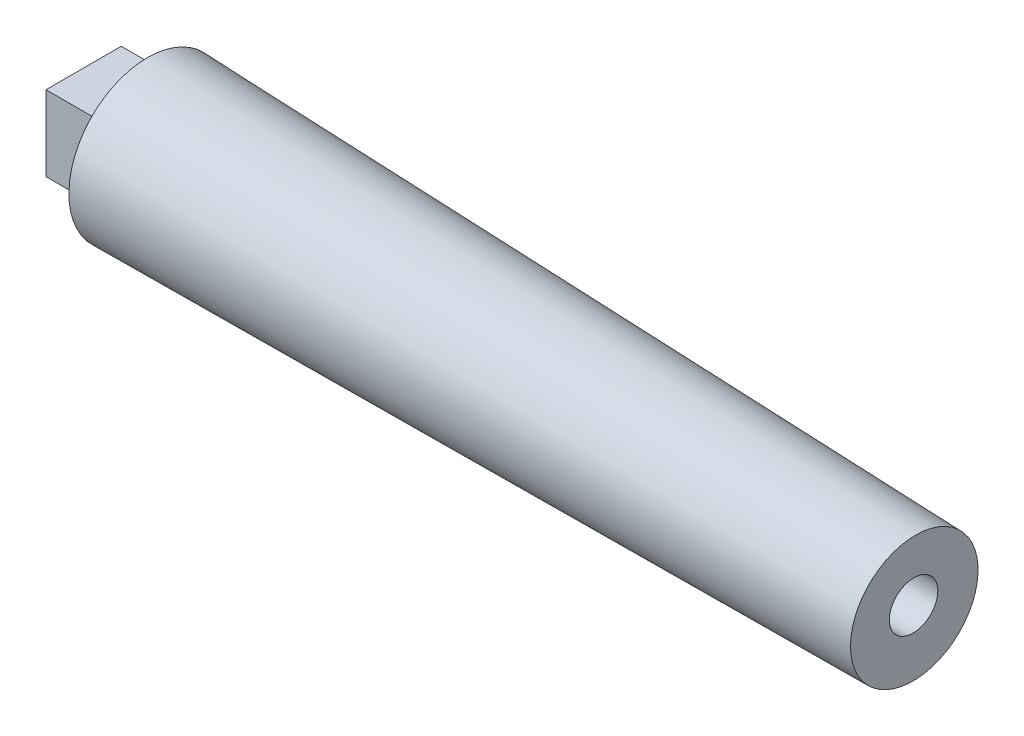
ISO-10303-21;
HEADER;
FILE_DESCRIPTION(('STEP AP214'),'2;1');
FILE_NAME('part.step','',(''),(''),'','','');
FILE_SCHEMA(('AUTOMOTIVE_DESIGN { 1 0 10303 214 1 1 1 1 }'));
ENDSEC;
DATA;
#1=APPLICATION_CONTEXT('core data for automotive mechanical design processes');
#2=APPLICATION_PROTOCOL_DEFINITION('international standard','automotive_design',2000,#1);
#3=PRODUCT_CONTEXT('',#1,'mechanical');
#4=PRODUCT('Part','Part','',(#3));
#5=PRODUCT_RELATED_PRODUCT_CATEGORY('part','',(#4));
#6=PRODUCT_DEFINITION_FORMATION('','',#4);
#7=PRODUCT_DEFINITION_CONTEXT('part definition',#1,'design');
#8=PRODUCT_DEFINITION('design','',#6,#7);
#9=PRODUCT_DEFINITION_SHAPE('','',#8);
#10=(LENGTH_UNIT() NAMED_UNIT(*) SI_UNIT(.MILLI.,.METRE.));
#11=(NAMED_UNIT(*) PLANE_ANGLE_UNIT() SI_UNIT($,.RADIAN.));
#12=(NAMED_UNIT(*) SI_UNIT($,.STERADIAN.) SOLID_ANGLE_UNIT());
#13=UNCERTAINTY_MEASURE_WITH_UNIT(LENGTH_MEASURE(1.E-05),#10,'distance_accuracy_value','');
#14=(GEOMETRIC_REPRESENTATION_CONTEXT(3) GLOBAL_UNCERTAINTY_ASSIGNED_CONTEXT((#13)) GLOBAL_UNIT_ASSIGNED_CONTEXT((#10,
#11,#12)) REPRESENTATION_CONTEXT('',''));
#15=CARTESIAN_POINT('',(0.,0.,0.));
#16=DIRECTION('',(0.,0.,1.));
#17=DIRECTION('',(1.,0.,0.));
#18=AXIS2_PLACEMENT_3D('',#15,#16,#17);
#19=CARTESIAN_POINT('',(12.7,15.875,0.));
#20=DIRECTION('',(1.,0.,0.));
#21=DIRECTION('',(0.,0.,-1.));
#22=AXIS2_PLACEMENT_3D('',#19,#20,#21);
#23=PLANE('',#22);
#24=CARTESIAN_POINT('',(12.7,15.6365519792823,0.));
#25=DIRECTION('',(1.,0.,0.));
#26=DIRECTION('',(0.,1.,0.));
#27=AXIS2_PLACEMENT_3D('',#24,#25,#26);
#28=ELLIPSE('',#27,15.6365519792823,15.6336603376525);
#29=CARTESIAN_POINT('',(12.7,31.2731039585646,0.));
#30=VERTEX_POINT('',#29);
#31=EDGE_CURVE('E43',#30,#30,#28,.T.);
#32=ORIENTED_EDGE('',*,*,#31,.F.);
#33=EDGE_LOOP('',(#32));
#34=FACE_BOUND('',#33,.T.);
#35=DIRECTION('',(0.,-1.,0.));
#36=VECTOR('',#35,1.);
#37=CARTESIAN_POINT('',(12.7,8.14355197928228,-7.493));
#38=LINE('',#37,#36);
#39=CARTESIAN_POINT('',(12.7,23.1295519792823,-7.493));
#40=VERTEX_POINT('',#39);
#41=CARTESIAN_POINT('',(12.7,8.14355197928228,-7.493));
#42=VERTEX_POINT('',#41);
#43=EDGE_CURVE('E56',#40,#42,#38,.T.);
#44=ORIENTED_EDGE('',*,*,#43,.F.);
#45=DIRECTION('',(0.,0.,-1.));
#46=VECTOR('',#45,1.);
#47=CARTESIAN_POINT('',(12.7,23.1295519792823,7.493));
#48=LINE('',#47,#46);
#49=CARTESIAN_POINT('',(12.7,23.1295519792823,7.493));
#50=VERTEX_POINT('',#49);
#51=EDGE_CURVE('E60',#50,#40,#48,.T.);
#52=ORIENTED_EDGE('',*,*,#51,.F.);
#53=DIRECTION('',(0.,1.,0.));
#54=VECTOR('',#53,1.);
#55=CARTESIAN_POINT('',(12.7,8.14355197928228,7.493));
#56=LINE('',#55,#54);
#57=CARTESIAN_POINT('',(12.7,8.14355197928228,7.493));
#58=VERTEX_POINT('',#57);
#59=EDGE_CURVE('E217',#58,#50,#56,.T.);
#60=ORIENTED_EDGE('',*,*,#59,.F.);
#61=DIRECTION('',(0.,0.,1.));
#62=VECTOR('',#61,1.);
#63=CARTESIAN_POINT('',(12.7,8.14355197928228,7.493));
#64=LINE('',#63,#62);
#65=EDGE_CURVE('E223',#42,#58,#64,.T.);
#66=ORIENTED_EDGE('',*,*,#65,.F.);
#67=EDGE_LOOP('',(#44,#52,#60,#66));
#68=FACE_BOUND('',#67,.T.);
#69=ADVANCED_FACE('F38',(#34,#68),#23,.F.);
#70=CARTESIAN_POINT('',(165.344140480591,12.6953049907579,0.));
#71=DIRECTION('',(0.999815140029847,-0.0192272142313432,0.));
#72=DIRECTION('',(0.0192272142313432,0.999815140029847,0.));
#73=AXIS2_PLACEMENT_3D('',#70,#71,#72);
#74=CONICAL_SURFACE('',#73,12.6976522783791,1.55156792769519);
#75=CARTESIAN_POINT('',(165.118824940584,9.16394355556683,-2.80726810967393));
#76=CARTESIAN_POINT('',(165.117177435404,9.0850823697369,-2.6969955699286));
#77=CARTESIAN_POINT('',(165.115626977906,9.01087991331,-2.58340963014332));
#78=CARTESIAN_POINT('',(165.112730413735,8.87227436931595,-2.35035579300256));
#79=CARTESIAN_POINT('',(165.111384360859,8.807873861463,-2.23088635811849));
#80=CARTESIAN_POINT('',(165.108905886309,8.6893079553302,-1.98684089907101));
#81=CARTESIAN_POINT('',(165.107773655879,8.63515171948645,-1.86226042364553));
#82=CARTESIAN_POINT('',(165.105732119441,8.53751149179208,-1.60893040866076));
#83=CARTESIAN_POINT('',(165.104822895104,8.49403140979011,-1.48017936122461));
#84=CARTESIAN_POINT('',(165.103235219138,8.41811257048996,-1.2195817889906));
#85=CARTESIAN_POINT('',(165.1025565687,8.3856643011731,-1.08773803624114));
#86=CARTESIAN_POINT('',(165.101433677073,8.331978125664,-0.821735806886713));
#87=CARTESIAN_POINT('',(165.100989522407,8.31074435737646,-0.687576494719908));
#88=CARTESIAN_POINT('',(165.100339436785,8.27966631010797,-0.418028622223942));
#89=CARTESIAN_POINT('',(165.100133358877,8.26981500537878,-0.28264087221383));
#90=CARTESIAN_POINT('',(165.099960397741,8.26154677806,-0.0114664026823696));
#91=CARTESIAN_POINT('',(165.099993602815,8.26313407664514,0.124320445638477));
#92=CARTESIAN_POINT('',(165.10029911597,8.27773891997873,0.395225344775019));
#93=CARTESIAN_POINT('',(165.10057133216,8.29075207192221,0.530343632552104));
#94=CARTESIAN_POINT('',(165.101352907777,8.32811693970273,0.799053488166787));
#95=CARTESIAN_POINT('',(165.101862354721,8.3524728400597,0.932644473907819));
#96=CARTESIAN_POINT('',(165.103114511621,8.41234138537399,1.19725513672312));
#97=CARTESIAN_POINT('',(165.103857144513,8.44785034440192,1.32827564812596));
#98=CARTESIAN_POINT('',(165.105570645652,8.52978983384384,1.58690744048589));
#99=CARTESIAN_POINT('',(165.106541598073,8.57622439208837,1.7145174447586));
#100=CARTESIAN_POINT('',(165.10870415392,8.67965895133826,1.96532457405025));
#101=CARTESIAN_POINT('',(165.109895675584,8.73665503727417,2.08852331416048));
#102=CARTESIAN_POINT('',(165.112491393798,8.86083877620813,2.32972494007424));
#103=CARTESIAN_POINT('',(165.113895668696,8.92803018377897,2.4477258909757));
#104=CARTESIAN_POINT('',(165.116906052725,9.07209440169764,2.67760983214706));
#105=CARTESIAN_POINT('',(165.118512086864,9.14896361494368,2.78949507349267));
#106=CARTESIAN_POINT('',(165.121914622064,9.31184831253536,3.00641137090818));
#107=CARTESIAN_POINT('',(165.123711193236,9.39786716367154,3.11143988080694));
#108=CARTESIAN_POINT('',(165.129367388915,9.66873713221854,3.41503214628105));
#109=CARTESIAN_POINT('',(165.133496317631,9.86653668233495,3.60231765530036));
#110=CARTESIAN_POINT('',(165.14234535723,10.2906550596169,3.94091615297854));
#111=CARTESIAN_POINT('',(165.147065467707,10.5169738672964,4.09222916621582));
#112=CARTESIAN_POINT('',(165.156964987461,10.9918687391833,4.35477362141857));
#113=CARTESIAN_POINT('',(165.162144493476,11.2404494913722,4.46599659621835));
#114=CARTESIAN_POINT('',(165.172813396242,11.752742222812,4.64512271365306));
#115=CARTESIAN_POINT('',(165.178302793661,12.0164542346166,4.71302576308504));
#116=CARTESIAN_POINT('',(165.189436399727,12.5515823478162,4.80360641201797));
#117=CARTESIAN_POINT('',(165.195080636153,12.8229998319408,4.82627584175275));
#118=CARTESIAN_POINT('',(165.206362715635,13.3657873528474,4.82571907353749));
#119=CARTESIAN_POINT('',(165.212000558689,13.6371573896203,4.80249286673301));
#120=CARTESIAN_POINT('',(165.223110683477,14.1721677074532,4.71080058549499));
#121=CARTESIAN_POINT('',(165.228582953215,14.4358074284258,4.64233124146104));
#122=CARTESIAN_POINT('',(165.239206937811,14.9478512802739,4.46209056827802));
#123=CARTESIAN_POINT('',(165.244358652679,15.196255411593,4.35031924038968));
#124=CARTESIAN_POINT('',(165.254195957294,15.6707576208351,4.08665363485065));
#125=CARTESIAN_POINT('',(165.258881578339,15.8968571965175,3.93476205381246));
#126=CARTESIAN_POINT('',(165.267655193045,16.3203465304676,3.59516150487198));
#127=CARTESIAN_POINT('',(165.271743187235,16.5177363141759,3.40745256870897));
#128=CARTESIAN_POINT('',(165.279205942098,16.8781649320521,3.00158060487075));
#129=CARTESIAN_POINT('',(165.282580828298,17.0412098119203,2.78342294831416));
#130=CARTESIAN_POINT('',(165.288523481302,17.3283587014104,2.32282061018475));
#131=CARTESIAN_POINT('',(165.291091249001,17.4524627542041,2.08037595553815));
#132=CARTESIAN_POINT('',(165.295347135875,17.6581802732935,1.57813612013218));
#133=CARTESIAN_POINT('',(165.297035437929,17.7398025733804,1.31834455923135));
#134=CARTESIAN_POINT('',(165.299485837864,17.8582753103159,0.788741691752848));
#135=CARTESIAN_POINT('',(165.300247936759,17.8951257962039,0.518930396150355));
#136=CARTESIAN_POINT('',(165.300824517652,17.9230054010489,-0.0230095006544861));
#137=CARTESIAN_POINT('',(165.300639141526,17.9140413803211,-0.295137748821622));
#138=CARTESIAN_POINT('',(165.299326281197,17.8505618097494,-0.834026595234222));
#139=CARTESIAN_POINT('',(165.298198796952,17.7960462577928,-1.10078719323073));
#140=CARTESIAN_POINT('',(165.295033445299,17.6430182820338,-1.62135967569435));
#141=CARTESIAN_POINT('',(165.29299560165,17.5445070064396,-1.87517189789788));
#142=CARTESIAN_POINT('',(165.288066452295,17.3062754537265,-2.36265881858538));
#143=CARTESIAN_POINT('',(165.285175147145,17.1665552035325,-2.59633353022659));
#144=CARTESIAN_POINT('',(165.278620752922,16.8499012393037,-3.03691572914393));
#145=CARTESIAN_POINT('',(165.274957580706,16.672963516363,-3.24382032897796));
#146=CARTESIAN_POINT('',(165.26695909212,16.2867443013387,-3.62505702617346));
#147=CARTESIAN_POINT('',(165.262623773875,16.0774627189722,-3.79938903261047));
#148=CARTESIAN_POINT('',(165.255714666993,15.7440563864797,-4.0325907168491));
#149=CARTESIAN_POINT('',(165.253342312563,15.6295949802119,-4.10564582233011));
#150=CARTESIAN_POINT('',(165.24847790864,15.3949412531297,-4.24185190291121));
#151=CARTESIAN_POINT('',(165.245985903606,15.2747510610412,-4.30500652003419));
#152=CARTESIAN_POINT('',(165.24089869849,15.0294423834271,-4.42098292452977));
#153=CARTESIAN_POINT('',(165.238303460373,14.904322081632,-4.47380086025795));
#154=CARTESIAN_POINT('',(165.233029773542,14.6501229126455,-4.56869127331142));
#155=CARTESIAN_POINT('',(165.230351355868,14.5210455223644,-4.6107677063073));
#156=CARTESIAN_POINT('',(165.224927767524,14.2597307407153,-4.68392105026887));
#157=CARTESIAN_POINT('',(165.222182558603,14.1274915393951,-4.71499149182489));
#158=CARTESIAN_POINT('',(165.21664734203,13.8609153158847,-4.76586901937114));
#159=CARTESIAN_POINT('',(165.213857351273,13.7265790854475,-4.78568025552272));
#160=CARTESIAN_POINT('',(165.208250409801,13.4566711583288,-4.81392099251392));
#161=CARTESIAN_POINT('',(165.20543345048,13.3210990679951,-4.82234672948459));
#162=CARTESIAN_POINT('',(165.199794505779,13.049777343681,-4.82774349414403));
#163=CARTESIAN_POINT('',(165.196972522638,12.9140277936825,-4.82471874783329));
#164=CARTESIAN_POINT('',(165.19134145136,12.6432141388134,-4.80724212717664));
#165=CARTESIAN_POINT('',(165.188532368525,12.5081503137128,-4.79278591532296));
#166=CARTESIAN_POINT('',(165.182949193074,12.2397700946182,-4.75255111741622));
#167=CARTESIAN_POINT('',(165.180175087934,12.1064530744036,-4.7267767099744));
#168=CARTESIAN_POINT('',(165.174678859257,11.8423811484354,-4.66406992341552));
#169=CARTESIAN_POINT('',(165.171956768916,11.7116278775783,-4.62713065609769));
#170=CARTESIAN_POINT('',(165.166586765509,11.4537464321029,-4.54237796429386));
#171=CARTESIAN_POINT('',(165.163938825466,11.326616938736,-4.49456855397736));
#172=CARTESIAN_POINT('',(165.158732844898,11.076733236123,-4.38836337514482));
#173=CARTESIAN_POINT('',(165.156174880482,10.9539827297337,-4.32995889002443));
#174=CARTESIAN_POINT('',(165.151170428398,10.7138866615595,-4.20302936798501));
#175=CARTESIAN_POINT('',(165.148723900297,10.5965391392025,-4.13450804072753));
#176=CARTESIAN_POINT('',(165.143960972625,10.368136586148,-3.98787949786579));
#177=CARTESIAN_POINT('',(165.141644458983,10.2570760385929,-3.90978088312383));
#178=CARTESIAN_POINT('',(165.137156580108,10.0419594663487,-3.74453387620693));
#179=CARTESIAN_POINT('',(165.134985176839,9.93790160606695,-3.65738787094555));
#180=CARTESIAN_POINT('',(165.130280899786,9.71250861019547,-3.45185433631737));
#181=CARTESIAN_POINT('',(165.127792710549,9.59332607705745,-3.33109184642467));
#182=CARTESIAN_POINT('',(165.123094142763,9.36831843969481,-3.07770040275353));
#183=CARTESIAN_POINT('',(165.120883764241,9.26249333673081,-2.94507144785521));
#184=CARTESIAN_POINT('',(165.118824940584,9.16394355556683,-2.80726810967393));
#185=B_SPLINE_CURVE_WITH_KNOTS('',3,(#75,#76,#77,#78,#79,#80,#81,#82,#83,#84,#85,#86,#87,#88,
#89,#90,#91,#92,#93,#94,#95,#96,#97,#98,#99,#100,#101,#102,#103,#104,#105,#106,#107,#108,#109,
#110,#111,#112,#113,#114,#115,#116,#117,#118,#119,#120,#121,#122,#123,#124,#125,#126,#127,#128,
#129,#130,#131,#132,#133,#134,#135,#136,#137,#138,#139,#140,#141,#142,#143,#144,#145,#146,#147,
#148,#149,#150,#151,#152,#153,#154,#155,#156,#157,#158,#159,#160,#161,#162,#163,#164,#165,#166,
#167,#168,#169,#170,#171,#172,#173,#174,#175,#176,#177,#178,#179,#180,#181,#182,#183,#184),
.UNSPECIFIED.,.T.,.F.,(4,2,2,2,2,2,2,2,2,2,2,2,2,2,2,2,2,2,2,2,2,2,2,2,2,2,2,2,2,2,2,2,2,2,2,2,
2,2,2,2,2,2,2,2,2,2,2,2,2,2,2,2,2,2,4),(0.,0.406590899649994,0.81328862309365,1.22034839305433,
1.627557015894,2.03441363328987,2.44142026715154,2.8481755445031,3.25508093397529,
3.66182995230655,4.06872914582008,4.47549400610328,4.88240905989843,5.28917357436678,
5.69608825087575,6.10285212708182,6.50976620132871,7.32284221805564,8.13591767924221,
8.94916476451681,9.76241359948918,10.5758093042384,11.3892051659121,12.2026598159569,
13.0161144423178,13.8295144076581,14.6429136522133,15.4561695950105,16.2694246361874,
17.0825104988802,17.8955954709814,18.7085586944026,19.5215219555298,20.334464001037,
21.1474055153887,21.9604346411858,22.7734660364717,23.1804973577841,23.587378594206,
23.994411154861,24.4012936045886,24.8084148277337,25.2153858878452,25.622491453372,
26.0294467841431,26.4365566024896,26.8435162444869,27.2507274759906,27.6577885744569,
28.0651860948978,28.4724345994023,28.8793200173666,29.2860983609055,29.7941992724062,
30.302300231859),.UNSPECIFIED.);
#186=CARTESIAN_POINT('',(165.118824940584,9.16394355556683,-2.80726810967393));
#187=VERTEX_POINT('',#186);
#188=EDGE_CURVE('E48',#187,#187,#185,.T.);
#189=ORIENTED_EDGE('',*,*,#188,.T.);
#190=EDGE_LOOP('',(#189));
#191=FACE_BOUND('',#190,.T.);
#192=CARTESIAN_POINT('',(165.344140480591,12.6953049907579,0.));
#193=DIRECTION('',(0.999815140029847,-0.0192272142313432,0.));
#194=DIRECTION('',(0.0192272142313432,0.999815140029847,0.));
#195=AXIS2_PLACEMENT_3D('',#192,#193,#194);
#196=CIRCLE('',#195,12.6976522783791);
#197=CARTESIAN_POINT('',(165.588280961183,25.3906099815157,0.));
#198=VERTEX_POINT('',#197);
#199=EDGE_CURVE('E11',#198,#198,#196,.T.);
#200=ORIENTED_EDGE('',*,*,#199,.T.);
#201=EDGE_LOOP('',(#200));
#202=FACE_BOUND('',#201,.T.);
#203=ADVANCED_FACE('F40',(#191,#202),#74,.F.);
#204=CARTESIAN_POINT('',(0.305175600739394,15.8691312384473,0.));
#205=DIRECTION('',(-0.999815140029847,0.0192272142313432,0.));
#206=DIRECTION('',(-0.0192272142313432,-0.999815140029847,0.));
#207=AXIS2_PLACEMENT_3D('',#204,#205,#206);
#208=CONICAL_SURFACE('',#207,15.8720653479738,0.0192283990997072);
#209=ORIENTED_EDGE('',*,*,#31,.T.);
#210=EDGE_LOOP('',(#209));
#211=FACE_BOUND('',#210,.T.);
#212=ORIENTED_EDGE('',*,*,#199,.F.);
#213=EDGE_LOOP('',(#212));
#214=FACE_BOUND('',#213,.T.);
#215=ADVANCED_FACE('F120',(#211,#214),#208,.T.);
#216=CARTESIAN_POINT('',(152.4,13.0894399267802,0.));
#217=DIRECTION('',(1.,0.,0.));
#218=DIRECTION('',(0.,0.,-1.));
#219=AXIS2_PLACEMENT_3D('',#216,#217,#218);
#220=CYLINDRICAL_SURFACE('',#219,4.826);
#221=CARTESIAN_POINT('',(152.4,13.0894399267802,0.));
#222=DIRECTION('',(1.,0.,0.));
#223=DIRECTION('',(0.,0.,-1.));
#224=AXIS2_PLACEMENT_3D('',#221,#222,#223);
#225=CIRCLE('',#224,4.826);
#226=CARTESIAN_POINT('',(152.4,13.0894399267802,-4.826));
#227=VERTEX_POINT('',#226);
#228=EDGE_CURVE('E104',#227,#227,#225,.T.);
#229=ORIENTED_EDGE('',*,*,#228,.F.);
#230=EDGE_LOOP('',(#229));
#231=FACE_BOUND('',#230,.T.);
#232=ORIENTED_EDGE('',*,*,#188,.F.);
#233=EDGE_LOOP('',(#232));
#234=FACE_BOUND('',#233,.T.);
#235=ADVANCED_FACE('F115',(#231,#234),#220,.F.);
#236=CARTESIAN_POINT('',(152.4,13.0894399267802,0.));
#237=DIRECTION('',(1.,0.,0.));
#238=DIRECTION('',(0.,0.,-1.));
#239=AXIS2_PLACEMENT_3D('',#236,#237,#238);
#240=PLANE('',#239);
#241=ORIENTED_EDGE('',*,*,#228,.T.);
#242=EDGE_LOOP('',(#241));
#243=FACE_BOUND('',#242,.T.);
#244=ADVANCED_FACE('F119',(#243),#240,.T.);
#245=CARTESIAN_POINT('',(0.,8.14355197928228,-7.493));
#246=DIRECTION('',(0.,0.,1.));
#247=DIRECTION('',(1.,0.,0.));
#248=AXIS2_PLACEMENT_3D('',#245,#246,#247);
#249=PLANE('',#248);
#250=ORIENTED_EDGE('',*,*,#43,.T.);
#251=DIRECTION('',(1.,0.,0.));
#252=VECTOR('',#251,1.);
#253=CARTESIAN_POINT('',(0.,8.14355197928228,-7.493));
#254=LINE('',#253,#252);
#255=CARTESIAN_POINT('',(0.,8.14355197928228,-7.493));
#256=VERTEX_POINT('',#255);
#257=EDGE_CURVE('E85',#256,#42,#254,.T.);
#258=ORIENTED_EDGE('',*,*,#257,.F.);
#259=DIRECTION('',(0.,-1.,0.));
#260=VECTOR('',#259,1.);
#261=CARTESIAN_POINT('',(0.,8.14355197928228,-7.493));
#262=LINE('',#261,#260);
#263=CARTESIAN_POINT('',(0.,23.1295519792823,-7.493));
#264=VERTEX_POINT('',#263);
#265=EDGE_CURVE('E91',#264,#256,#262,.T.);
#266=ORIENTED_EDGE('',*,*,#265,.F.);
#267=DIRECTION('',(1.,0.,0.));
#268=VECTOR('',#267,1.);
#269=CARTESIAN_POINT('',(0.,23.1295519792823,-7.493));
#270=LINE('',#269,#268);
#271=EDGE_CURVE('E215',#264,#40,#270,.T.);
#272=ORIENTED_EDGE('',*,*,#271,.T.);
#273=EDGE_LOOP('',(#250,#258,#266,#272));
#274=FACE_BOUND('',#273,.T.);
#275=ADVANCED_FACE('F101',(#274),#249,.F.);
#276=CARTESIAN_POINT('',(0.,8.14355197928228,7.493));
#277=DIRECTION('',(0.,1.,0.));
#278=DIRECTION('',(0.,0.,1.));
#279=AXIS2_PLACEMENT_3D('',#276,#277,#278);
#280=PLANE('',#279);
#281=ORIENTED_EDGE('',*,*,#65,.T.);
#282=DIRECTION('',(1.,0.,0.));
#283=VECTOR('',#282,1.);
#284=CARTESIAN_POINT('',(0.,8.14355197928228,7.493));
#285=LINE('',#284,#283);
#286=CARTESIAN_POINT('',(0.,8.14355197928228,7.493));
#287=VERTEX_POINT('',#286);
#288=EDGE_CURVE('E87',#287,#58,#285,.T.);
#289=ORIENTED_EDGE('',*,*,#288,.F.);
#290=DIRECTION('',(0.,0.,1.));
#291=VECTOR('',#290,1.);
#292=CARTESIAN_POINT('',(0.,8.14355197928228,7.493));
#293=LINE('',#292,#291);
#294=EDGE_CURVE('E80',#256,#287,#293,.T.);
#295=ORIENTED_EDGE('',*,*,#294,.F.);
#296=ORIENTED_EDGE('',*,*,#257,.T.);
#297=EDGE_LOOP('',(#281,#289,#295,#296));
#298=FACE_BOUND('',#297,.T.);
#299=ADVANCED_FACE('F83',(#298),#280,.F.);
#300=CARTESIAN_POINT('',(0.,8.14355197928228,7.493));
#301=DIRECTION('',(0.,0.,-1.));
#302=DIRECTION('',(-1.,0.,0.));
#303=AXIS2_PLACEMENT_3D('',#300,#301,#302);
#304=PLANE('',#303);
#305=ORIENTED_EDGE('',*,*,#59,.T.);
#306=DIRECTION('',(1.,0.,0.));
#307=VECTOR('',#306,1.);
#308=CARTESIAN_POINT('',(0.,23.1295519792823,7.493));
#309=LINE('',#308,#307);
#310=CARTESIAN_POINT('',(0.,23.1295519792823,7.493));
#311=VERTEX_POINT('',#310);
#312=EDGE_CURVE('E105',#311,#50,#309,.T.);
#313=ORIENTED_EDGE('',*,*,#312,.F.);
#314=DIRECTION('',(0.,1.,0.));
#315=VECTOR('',#314,1.);
#316=CARTESIAN_POINT('',(0.,8.14355197928228,7.493));
#317=LINE('',#316,#315);
#318=EDGE_CURVE('E90',#287,#311,#317,.T.);
#319=ORIENTED_EDGE('',*,*,#318,.F.);
#320=ORIENTED_EDGE('',*,*,#288,.T.);
#321=EDGE_LOOP('',(#305,#313,#319,#320));
#322=FACE_BOUND('',#321,.T.);
#323=ADVANCED_FACE('F140',(#322),#304,.F.);
#324=CARTESIAN_POINT('',(0.,23.1295519792823,7.493));
#325=DIRECTION('',(0.,-1.,0.));
#326=DIRECTION('',(0.,0.,-1.));
#327=AXIS2_PLACEMENT_3D('',#324,#325,#326);
#328=PLANE('',#327);
#329=ORIENTED_EDGE('',*,*,#51,.T.);
#330=ORIENTED_EDGE('',*,*,#271,.F.);
#331=DIRECTION('',(0.,0.,-1.));
#332=VECTOR('',#331,1.);
#333=CARTESIAN_POINT('',(0.,23.1295519792823,7.493));
#334=LINE('',#333,#332);
#335=EDGE_CURVE('E96',#311,#264,#334,.T.);
#336=ORIENTED_EDGE('',*,*,#335,.F.);
#337=ORIENTED_EDGE('',*,*,#312,.T.);
#338=EDGE_LOOP('',(#329,#330,#336,#337));
#339=FACE_BOUND('',#338,.T.);
#340=ADVANCED_FACE('F143',(#339),#328,.F.);
#341=CARTESIAN_POINT('',(0.,0.,0.));
#342=DIRECTION('',(-1.,0.,0.));
#343=DIRECTION('',(0.,0.,1.));
#344=AXIS2_PLACEMENT_3D('',#341,#342,#343);
#345=PLANE('',#344);
#346=ORIENTED_EDGE('',*,*,#265,.T.);
#347=ORIENTED_EDGE('',*,*,#294,.T.);
#348=ORIENTED_EDGE('',*,*,#318,.T.);
#349=ORIENTED_EDGE('',*,*,#335,.T.);
#350=EDGE_LOOP('',(#346,#347,#348,#349));
#351=FACE_BOUND('',#350,.T.);
#352=ADVANCED_FACE('F94',(#351),#345,.T.);
#353=CLOSED_SHELL('',(#69,#203,#215,#235,#244,#275,#299,#323,#340,#352));
#354=MANIFOLD_SOLID_BREP('B2',#353);
#355=ADVANCED_BREP_SHAPE_REPRESENTATION('',(#18,#354),#14);
#356=SHAPE_DEFINITION_REPRESENTATION(#9,#355);
ENDSEC;
END-ISO-10303-21;
